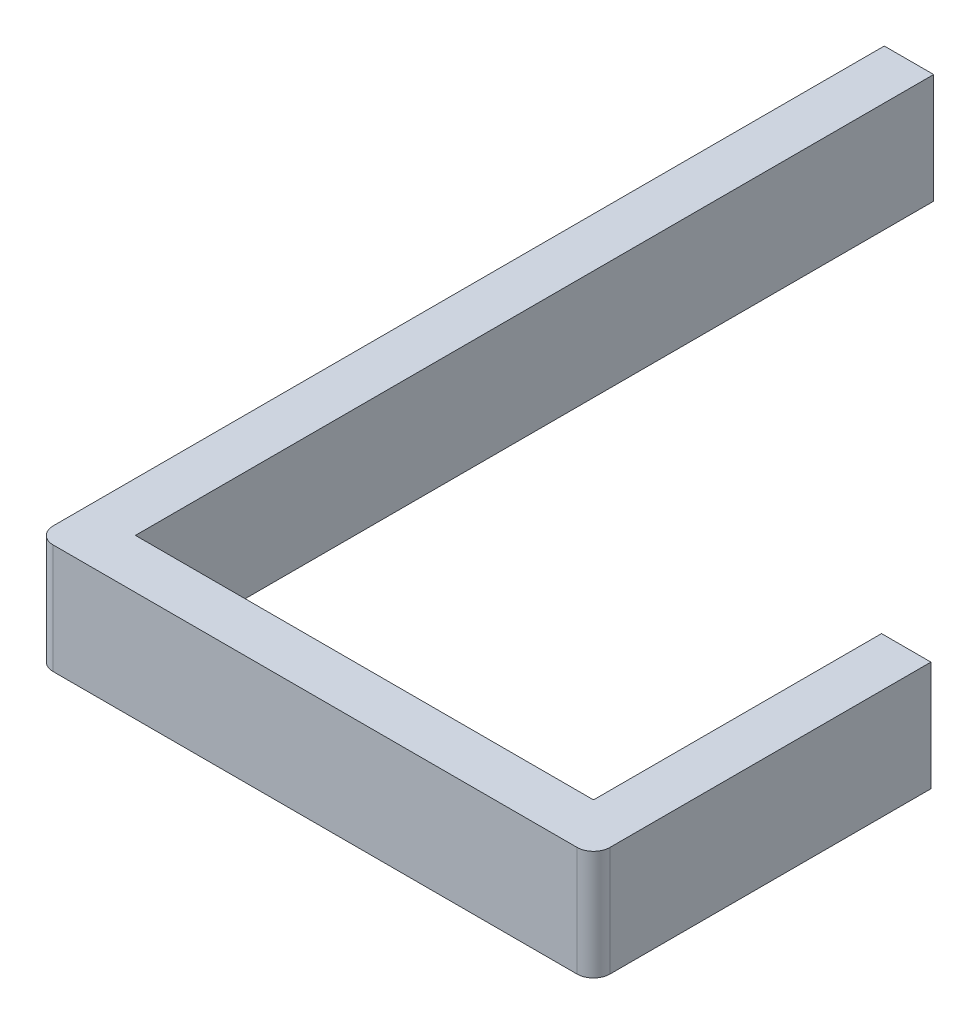
ISO-10303-21;
HEADER;
FILE_DESCRIPTION(('STEP AP214'),'2;1');
FILE_NAME('part.step','',(''),(''),'','','');
FILE_SCHEMA(('AUTOMOTIVE_DESIGN { 1 0 10303 214 1 1 1 1 }'));
ENDSEC;
DATA;
#1=APPLICATION_CONTEXT('core data for automotive mechanical design processes');
#2=APPLICATION_PROTOCOL_DEFINITION('international standard','automotive_design',2000,#1);
#3=PRODUCT_CONTEXT('',#1,'mechanical');
#4=PRODUCT('Part','Part','',(#3));
#5=PRODUCT_RELATED_PRODUCT_CATEGORY('part','',(#4));
#6=PRODUCT_DEFINITION_FORMATION('','',#4);
#7=PRODUCT_DEFINITION_CONTEXT('part definition',#1,'design');
#8=PRODUCT_DEFINITION('design','',#6,#7);
#9=PRODUCT_DEFINITION_SHAPE('','',#8);
#10=(LENGTH_UNIT() NAMED_UNIT(*) SI_UNIT(.MILLI.,.METRE.));
#11=(NAMED_UNIT(*) PLANE_ANGLE_UNIT() SI_UNIT($,.RADIAN.));
#12=(NAMED_UNIT(*) SI_UNIT($,.STERADIAN.) SOLID_ANGLE_UNIT());
#13=UNCERTAINTY_MEASURE_WITH_UNIT(LENGTH_MEASURE(1.E-05),#10,'distance_accuracy_value','');
#14=(GEOMETRIC_REPRESENTATION_CONTEXT(3) GLOBAL_UNCERTAINTY_ASSIGNED_CONTEXT((#13)) GLOBAL_UNIT_ASSIGNED_CONTEXT((#10,
#11,#12)) REPRESENTATION_CONTEXT('',''));
#15=CARTESIAN_POINT('',(0.,0.,0.));
#16=DIRECTION('',(0.,0.,1.));
#17=DIRECTION('',(1.,0.,0.));
#18=AXIS2_PLACEMENT_3D('',#15,#16,#17);
#19=CARTESIAN_POINT('',(9.,20.,0.));
#20=DIRECTION('',(1.,0.,0.));
#21=DIRECTION('',(0.,0.,-1.));
#22=AXIS2_PLACEMENT_3D('',#19,#20,#21);
#23=PLANE('',#22);
#24=DIRECTION('',(0.,0.,1.));
#25=VECTOR('',#24,1.);
#26=CARTESIAN_POINT('',(9.,0.,0.));
#27=LINE('',#26,#25);
#28=CARTESIAN_POINT('',(8.99999999999999,0.,-40.));
#29=VERTEX_POINT('',#28);
#30=CARTESIAN_POINT('',(9.00000000000001,0.,105.5));
#31=VERTEX_POINT('',#30);
#32=EDGE_CURVE('E138',#29,#31,#27,.T.);
#33=ORIENTED_EDGE('',*,*,#32,.F.);
#34=DIRECTION('',(0.,-1.,0.));
#35=VECTOR('',#34,1.);
#36=CARTESIAN_POINT('',(8.99999999999999,20.,-40.));
#37=LINE('',#36,#35);
#38=CARTESIAN_POINT('',(8.99999999999999,20.,-40.));
#39=VERTEX_POINT('',#38);
#40=EDGE_CURVE('E136',#39,#29,#37,.T.);
#41=ORIENTED_EDGE('',*,*,#40,.F.);
#42=DIRECTION('',(0.,0.,1.));
#43=VECTOR('',#42,1.);
#44=CARTESIAN_POINT('',(9.,20.,0.));
#45=LINE('',#44,#43);
#46=CARTESIAN_POINT('',(9.00000000000001,20.,105.5));
#47=VERTEX_POINT('',#46);
#48=EDGE_CURVE('E122',#39,#47,#45,.T.);
#49=ORIENTED_EDGE('',*,*,#48,.T.);
#50=DIRECTION('',(0.,-1.,0.));
#51=VECTOR('',#50,1.);
#52=CARTESIAN_POINT('',(9.00000000000001,20.,105.5));
#53=LINE('',#52,#51);
#54=EDGE_CURVE('E163',#47,#31,#53,.T.);
#55=ORIENTED_EDGE('',*,*,#54,.T.);
#56=EDGE_LOOP('',(#33,#41,#49,#55));
#57=FACE_BOUND('',#56,.T.);
#58=ADVANCED_FACE('F43',(#57),#23,.T.);
#59=CARTESIAN_POINT('',(0.,20.,0.));
#60=DIRECTION('',(1.,0.,0.));
#61=DIRECTION('',(0.,0.,-1.));
#62=AXIS2_PLACEMENT_3D('',#59,#60,#61);
#63=PLANE('',#62);
#64=DIRECTION('',(0.,0.,1.));
#65=VECTOR('',#64,1.);
#66=CARTESIAN_POINT('',(0.,0.,0.));
#67=LINE('',#66,#65);
#68=CARTESIAN_POINT('',(0.,0.,-40.));
#69=VERTEX_POINT('',#68);
#70=CARTESIAN_POINT('',(0.,0.,111.5));
#71=VERTEX_POINT('',#70);
#72=EDGE_CURVE('E165',#69,#71,#67,.T.);
#73=ORIENTED_EDGE('',*,*,#72,.T.);
#74=DIRECTION('',(0.,-1.,0.));
#75=VECTOR('',#74,1.);
#76=CARTESIAN_POINT('',(0.,20.,111.5));
#77=LINE('',#76,#75);
#78=CARTESIAN_POINT('',(0.,20.,111.5));
#79=VERTEX_POINT('',#78);
#80=EDGE_CURVE('E11',#71,#79,#77,.F.);
#81=ORIENTED_EDGE('',*,*,#80,.T.);
#82=DIRECTION('',(0.,0.,1.));
#83=VECTOR('',#82,1.);
#84=CARTESIAN_POINT('',(0.,20.,0.));
#85=LINE('',#84,#83);
#86=CARTESIAN_POINT('',(0.,20.,-40.));
#87=VERTEX_POINT('',#86);
#88=EDGE_CURVE('E132',#87,#79,#85,.T.);
#89=ORIENTED_EDGE('',*,*,#88,.F.);
#90=DIRECTION('',(0.,-1.,0.));
#91=VECTOR('',#90,1.);
#92=CARTESIAN_POINT('',(0.,20.,-40.));
#93=LINE('',#92,#91);
#94=EDGE_CURVE('E146',#87,#69,#93,.T.);
#95=ORIENTED_EDGE('',*,*,#94,.T.);
#96=EDGE_LOOP('',(#73,#81,#89,#95));
#97=FACE_BOUND('',#96,.T.);
#98=ADVANCED_FACE('F216',(#97),#63,.F.);
#99=CARTESIAN_POINT('',(0.,20.,114.5));
#100=DIRECTION('',(0.,0.,-1.));
#101=DIRECTION('',(-1.,0.,0.));
#102=AXIS2_PLACEMENT_3D('',#99,#100,#101);
#103=PLANE('',#102);
#104=DIRECTION('',(1.,0.,0.));
#105=VECTOR('',#104,1.);
#106=CARTESIAN_POINT('',(0.,0.,114.5));
#107=LINE('',#106,#105);
#108=CARTESIAN_POINT('',(3.,0.,114.5));
#109=VERTEX_POINT('',#108);
#110=CARTESIAN_POINT('',(98.5,0.,114.5));
#111=VERTEX_POINT('',#110);
#112=EDGE_CURVE('E167',#109,#111,#107,.T.);
#113=ORIENTED_EDGE('',*,*,#112,.T.);
#114=DIRECTION('',(0.,-1.,0.));
#115=VECTOR('',#114,1.);
#116=CARTESIAN_POINT('',(98.5,20.,114.5));
#117=LINE('',#116,#115);
#118=CARTESIAN_POINT('',(98.5,20.,114.5));
#119=VERTEX_POINT('',#118);
#120=EDGE_CURVE('E64',#111,#119,#117,.F.);
#121=ORIENTED_EDGE('',*,*,#120,.T.);
#122=DIRECTION('',(1.,0.,0.));
#123=VECTOR('',#122,1.);
#124=CARTESIAN_POINT('',(0.,20.,114.5));
#125=LINE('',#124,#123);
#126=CARTESIAN_POINT('',(3.,20.,114.5));
#127=VERTEX_POINT('',#126);
#128=EDGE_CURVE('E152',#127,#119,#125,.T.);
#129=ORIENTED_EDGE('',*,*,#128,.F.);
#130=DIRECTION('',(0.,-1.,0.));
#131=VECTOR('',#130,1.);
#132=CARTESIAN_POINT('',(3.,20.,114.5));
#133=LINE('',#132,#131);
#134=EDGE_CURVE('E194',#127,#109,#133,.T.);
#135=ORIENTED_EDGE('',*,*,#134,.T.);
#136=EDGE_LOOP('',(#113,#121,#129,#135));
#137=FACE_BOUND('',#136,.T.);
#138=ADVANCED_FACE('F212',(#137),#103,.F.);
#139=CARTESIAN_POINT('',(101.5,20.,0.));
#140=DIRECTION('',(-1.,0.,0.));
#141=DIRECTION('',(0.,0.,1.));
#142=AXIS2_PLACEMENT_3D('',#139,#140,#141);
#143=PLANE('',#142);
#144=DIRECTION('',(0.,0.,-1.));
#145=VECTOR('',#144,1.);
#146=CARTESIAN_POINT('',(101.5,20.,0.));
#147=LINE('',#146,#145);
#148=CARTESIAN_POINT('',(101.5,20.,111.5));
#149=VERTEX_POINT('',#148);
#150=CARTESIAN_POINT('',(101.5,20.,53.));
#151=VERTEX_POINT('',#150);
#152=EDGE_CURVE('E154',#149,#151,#147,.T.);
#153=ORIENTED_EDGE('',*,*,#152,.F.);
#154=DIRECTION('',(0.,-1.,0.));
#155=VECTOR('',#154,1.);
#156=CARTESIAN_POINT('',(101.5,20.,111.5));
#157=LINE('',#156,#155);
#158=CARTESIAN_POINT('',(101.5,0.,111.5));
#159=VERTEX_POINT('',#158);
#160=EDGE_CURVE('E187',#149,#159,#157,.T.);
#161=ORIENTED_EDGE('',*,*,#160,.T.);
#162=DIRECTION('',(0.,0.,-1.));
#163=VECTOR('',#162,1.);
#164=CARTESIAN_POINT('',(101.5,0.,0.));
#165=LINE('',#164,#163);
#166=CARTESIAN_POINT('',(101.5,0.,53.));
#167=VERTEX_POINT('',#166);
#168=EDGE_CURVE('E169',#159,#167,#165,.T.);
#169=ORIENTED_EDGE('',*,*,#168,.T.);
#170=DIRECTION('',(0.,-1.,0.));
#171=VECTOR('',#170,1.);
#172=CARTESIAN_POINT('',(101.5,20.,53.));
#173=LINE('',#172,#171);
#174=EDGE_CURVE('E184',#151,#167,#173,.T.);
#175=ORIENTED_EDGE('',*,*,#174,.F.);
#176=EDGE_LOOP('',(#153,#161,#169,#175));
#177=FACE_BOUND('',#176,.T.);
#178=ADVANCED_FACE('F206',(#177),#143,.F.);
#179=CARTESIAN_POINT('',(0.,20.,52.9999999999999));
#180=DIRECTION('',(0.,0.,-1.));
#181=DIRECTION('',(-1.,0.,0.));
#182=AXIS2_PLACEMENT_3D('',#179,#180,#181);
#183=PLANE('',#182);
#184=DIRECTION('',(1.,0.,0.));
#185=VECTOR('',#184,1.);
#186=CARTESIAN_POINT('',(0.,0.,52.9999999999999));
#187=LINE('',#186,#185);
#188=CARTESIAN_POINT('',(92.5,0.,53.));
#189=VERTEX_POINT('',#188);
#190=EDGE_CURVE('E171',#189,#167,#187,.T.);
#191=ORIENTED_EDGE('',*,*,#190,.F.);
#192=DIRECTION('',(0.,-1.,0.));
#193=VECTOR('',#192,1.);
#194=CARTESIAN_POINT('',(92.5,20.,53.));
#195=LINE('',#194,#193);
#196=CARTESIAN_POINT('',(92.5,20.,53.));
#197=VERTEX_POINT('',#196);
#198=EDGE_CURVE('E182',#197,#189,#195,.T.);
#199=ORIENTED_EDGE('',*,*,#198,.F.);
#200=DIRECTION('',(1.,0.,0.));
#201=VECTOR('',#200,1.);
#202=CARTESIAN_POINT('',(0.,20.,52.9999999999999));
#203=LINE('',#202,#201);
#204=EDGE_CURVE('E156',#197,#151,#203,.T.);
#205=ORIENTED_EDGE('',*,*,#204,.T.);
#206=ORIENTED_EDGE('',*,*,#174,.T.);
#207=EDGE_LOOP('',(#191,#199,#205,#206));
#208=FACE_BOUND('',#207,.T.);
#209=ADVANCED_FACE('F247',(#208),#183,.T.);
#210=CARTESIAN_POINT('',(92.5,20.,0.));
#211=DIRECTION('',(-1.,0.,0.));
#212=DIRECTION('',(0.,0.,1.));
#213=AXIS2_PLACEMENT_3D('',#210,#211,#212);
#214=PLANE('',#213);
#215=DIRECTION('',(0.,0.,-1.));
#216=VECTOR('',#215,1.);
#217=CARTESIAN_POINT('',(92.5,0.,0.));
#218=LINE('',#217,#216);
#219=CARTESIAN_POINT('',(92.5,0.,105.5));
#220=VERTEX_POINT('',#219);
#221=EDGE_CURVE('E174',#220,#189,#218,.T.);
#222=ORIENTED_EDGE('',*,*,#221,.F.);
#223=DIRECTION('',(0.,-1.,0.));
#224=VECTOR('',#223,1.);
#225=CARTESIAN_POINT('',(92.5,20.,105.5));
#226=LINE('',#225,#224);
#227=CARTESIAN_POINT('',(92.5,20.,105.5));
#228=VERTEX_POINT('',#227);
#229=EDGE_CURVE('E180',#228,#220,#226,.T.);
#230=ORIENTED_EDGE('',*,*,#229,.F.);
#231=DIRECTION('',(0.,0.,-1.));
#232=VECTOR('',#231,1.);
#233=CARTESIAN_POINT('',(92.5,20.,0.));
#234=LINE('',#233,#232);
#235=EDGE_CURVE('E159',#228,#197,#234,.T.);
#236=ORIENTED_EDGE('',*,*,#235,.T.);
#237=ORIENTED_EDGE('',*,*,#198,.T.);
#238=EDGE_LOOP('',(#222,#230,#236,#237));
#239=FACE_BOUND('',#238,.T.);
#240=ADVANCED_FACE('F243',(#239),#214,.T.);
#241=CARTESIAN_POINT('',(0.,20.,105.5));
#242=DIRECTION('',(0.,0.,-1.));
#243=DIRECTION('',(-1.,0.,0.));
#244=AXIS2_PLACEMENT_3D('',#241,#242,#243);
#245=PLANE('',#244);
#246=DIRECTION('',(1.,0.,0.));
#247=VECTOR('',#246,1.);
#248=CARTESIAN_POINT('',(0.,0.,105.5));
#249=LINE('',#248,#247);
#250=EDGE_CURVE('E133',#31,#220,#249,.T.);
#251=ORIENTED_EDGE('',*,*,#250,.F.);
#252=ORIENTED_EDGE('',*,*,#54,.F.);
#253=DIRECTION('',(1.,0.,0.));
#254=VECTOR('',#253,1.);
#255=CARTESIAN_POINT('',(0.,20.,105.5));
#256=LINE('',#255,#254);
#257=EDGE_CURVE('E130',#47,#228,#256,.T.);
#258=ORIENTED_EDGE('',*,*,#257,.T.);
#259=ORIENTED_EDGE('',*,*,#229,.T.);
#260=EDGE_LOOP('',(#251,#252,#258,#259));
#261=FACE_BOUND('',#260,.T.);
#262=ADVANCED_FACE('F237',(#261),#245,.T.);
#263=CARTESIAN_POINT('',(0.,20.,0.));
#264=DIRECTION('',(0.,1.,0.));
#265=DIRECTION('',(0.,0.,1.));
#266=AXIS2_PLACEMENT_3D('',#263,#264,#265);
#267=PLANE('',#266);
#268=ORIENTED_EDGE('',*,*,#128,.T.);
#269=CARTESIAN_POINT('',(98.5,20.,111.5));
#270=DIRECTION('',(0.,1.,0.));
#271=DIRECTION('',(0.,0.,1.));
#272=AXIS2_PLACEMENT_3D('',#269,#270,#271);
#273=CIRCLE('',#272,3.);
#274=EDGE_CURVE('E51',#119,#149,#273,.T.);
#275=ORIENTED_EDGE('',*,*,#274,.T.);
#276=ORIENTED_EDGE('',*,*,#152,.T.);
#277=ORIENTED_EDGE('',*,*,#204,.F.);
#278=ORIENTED_EDGE('',*,*,#235,.F.);
#279=ORIENTED_EDGE('',*,*,#257,.F.);
#280=ORIENTED_EDGE('',*,*,#48,.F.);
#281=DIRECTION('',(-1.,0.,0.));
#282=VECTOR('',#281,1.);
#283=CARTESIAN_POINT('',(53.7213595499958,20.,-40.));
#284=LINE('',#283,#282);
#285=EDGE_CURVE('E126',#39,#87,#284,.T.);
#286=ORIENTED_EDGE('',*,*,#285,.T.);
#287=ORIENTED_EDGE('',*,*,#88,.T.);
#288=CARTESIAN_POINT('',(3.,20.,111.5));
#289=DIRECTION('',(0.,1.,0.));
#290=DIRECTION('',(0.,0.,1.));
#291=AXIS2_PLACEMENT_3D('',#288,#289,#290);
#292=CIRCLE('',#291,3.);
#293=EDGE_CURVE('E198',#79,#127,#292,.T.);
#294=ORIENTED_EDGE('',*,*,#293,.T.);
#295=EDGE_LOOP('',(#268,#275,#276,#277,#278,#279,#280,#286,#287,#294));
#296=FACE_BOUND('',#295,.T.);
#297=ADVANCED_FACE('F124',(#296),#267,.T.);
#298=CARTESIAN_POINT('',(0.,0.,0.));
#299=DIRECTION('',(0.,1.,0.));
#300=DIRECTION('',(0.,0.,1.));
#301=AXIS2_PLACEMENT_3D('',#298,#299,#300);
#302=PLANE('',#301);
#303=ORIENTED_EDGE('',*,*,#168,.F.);
#304=CARTESIAN_POINT('',(98.5,0.,111.5));
#305=DIRECTION('',(0.,1.,0.));
#306=DIRECTION('',(0.,0.,1.));
#307=AXIS2_PLACEMENT_3D('',#304,#305,#306);
#308=CIRCLE('',#307,3.);
#309=EDGE_CURVE('E192',#159,#111,#308,.F.);
#310=ORIENTED_EDGE('',*,*,#309,.T.);
#311=ORIENTED_EDGE('',*,*,#112,.F.);
#312=CARTESIAN_POINT('',(3.,0.,111.5));
#313=DIRECTION('',(0.,1.,0.));
#314=DIRECTION('',(0.,0.,1.));
#315=AXIS2_PLACEMENT_3D('',#312,#313,#314);
#316=CIRCLE('',#315,3.);
#317=EDGE_CURVE('E190',#109,#71,#316,.F.);
#318=ORIENTED_EDGE('',*,*,#317,.T.);
#319=ORIENTED_EDGE('',*,*,#72,.F.);
#320=DIRECTION('',(-1.,0.,0.));
#321=VECTOR('',#320,1.);
#322=CARTESIAN_POINT('',(53.7213595499958,0.,-40.));
#323=LINE('',#322,#321);
#324=EDGE_CURVE('E142',#29,#69,#323,.T.);
#325=ORIENTED_EDGE('',*,*,#324,.F.);
#326=ORIENTED_EDGE('',*,*,#32,.T.);
#327=ORIENTED_EDGE('',*,*,#250,.T.);
#328=ORIENTED_EDGE('',*,*,#221,.T.);
#329=ORIENTED_EDGE('',*,*,#190,.T.);
#330=EDGE_LOOP('',(#303,#310,#311,#318,#319,#325,#326,#327,#328,#329));
#331=FACE_BOUND('',#330,.T.);
#332=ADVANCED_FACE('F211',(#331),#302,.F.);
#333=CARTESIAN_POINT('',(98.5,20.,111.5));
#334=DIRECTION('',(0.,-1.,0.));
#335=DIRECTION('',(0.,0.,-1.));
#336=AXIS2_PLACEMENT_3D('',#333,#334,#335);
#337=CYLINDRICAL_SURFACE('',#336,3.);
#338=ORIENTED_EDGE('',*,*,#274,.F.);
#339=ORIENTED_EDGE('',*,*,#120,.F.);
#340=ORIENTED_EDGE('',*,*,#309,.F.);
#341=ORIENTED_EDGE('',*,*,#160,.F.);
#342=EDGE_LOOP('',(#338,#339,#340,#341));
#343=FACE_BOUND('',#342,.T.);
#344=ADVANCED_FACE('F208',(#343),#337,.T.);
#345=CARTESIAN_POINT('',(3.,20.,111.5));
#346=DIRECTION('',(0.,-1.,0.));
#347=DIRECTION('',(0.,0.,-1.));
#348=AXIS2_PLACEMENT_3D('',#345,#346,#347);
#349=CYLINDRICAL_SURFACE('',#348,3.);
#350=ORIENTED_EDGE('',*,*,#293,.F.);
#351=ORIENTED_EDGE('',*,*,#80,.F.);
#352=ORIENTED_EDGE('',*,*,#317,.F.);
#353=ORIENTED_EDGE('',*,*,#134,.F.);
#354=EDGE_LOOP('',(#350,#351,#352,#353));
#355=FACE_BOUND('',#354,.T.);
#356=ADVANCED_FACE('F45',(#355),#349,.T.);
#357=CARTESIAN_POINT('',(53.7213595499958,20.,-40.));
#358=DIRECTION('',(0.,0.,-1.));
#359=DIRECTION('',(-1.,0.,0.));
#360=AXIS2_PLACEMENT_3D('',#357,#358,#359);
#361=PLANE('',#360);
#362=ORIENTED_EDGE('',*,*,#285,.F.);
#363=ORIENTED_EDGE('',*,*,#40,.T.);
#364=ORIENTED_EDGE('',*,*,#324,.T.);
#365=ORIENTED_EDGE('',*,*,#94,.F.);
#366=EDGE_LOOP('',(#362,#363,#364,#365));
#367=FACE_BOUND('',#366,.T.);
#368=ADVANCED_FACE('F144',(#367),#361,.T.);
#369=CLOSED_SHELL('',(#58,#98,#138,#178,#209,#240,#262,#297,#332,#344,#356,#368));
#370=MANIFOLD_SOLID_BREP('B2',#369);
#371=ADVANCED_BREP_SHAPE_REPRESENTATION('',(#18,#370),#14);
#372=SHAPE_DEFINITION_REPRESENTATION(#9,#371);
ENDSEC;
END-ISO-10303-21;
